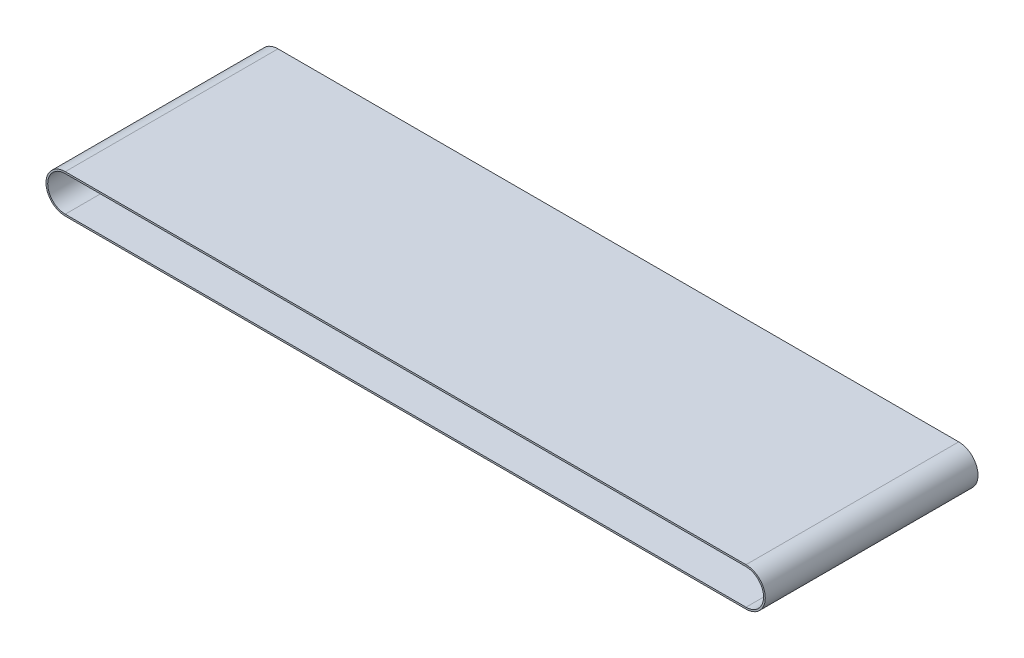
ISO-10303-21;
HEADER;
FILE_DESCRIPTION(('STEP AP214'),'2;1');
FILE_NAME('part.step','',(''),(''),'','','');
FILE_SCHEMA(('AUTOMOTIVE_DESIGN { 1 0 10303 214 1 1 1 1 }'));
ENDSEC;
DATA;
#1=APPLICATION_CONTEXT('core data for automotive mechanical design processes');
#2=APPLICATION_PROTOCOL_DEFINITION('international standard','automotive_design',2000,#1);
#3=PRODUCT_CONTEXT('',#1,'mechanical');
#4=PRODUCT('Part','Part','',(#3));
#5=PRODUCT_RELATED_PRODUCT_CATEGORY('part','',(#4));
#6=PRODUCT_DEFINITION_FORMATION('','',#4);
#7=PRODUCT_DEFINITION_CONTEXT('part definition',#1,'design');
#8=PRODUCT_DEFINITION('design','',#6,#7);
#9=PRODUCT_DEFINITION_SHAPE('','',#8);
#10=(LENGTH_UNIT() NAMED_UNIT(*) SI_UNIT(.MILLI.,.METRE.));
#11=(NAMED_UNIT(*) PLANE_ANGLE_UNIT() SI_UNIT($,.RADIAN.));
#12=(NAMED_UNIT(*) SI_UNIT($,.STERADIAN.) SOLID_ANGLE_UNIT());
#13=UNCERTAINTY_MEASURE_WITH_UNIT(LENGTH_MEASURE(1.E-05),#10,'distance_accuracy_value','');
#14=(GEOMETRIC_REPRESENTATION_CONTEXT(3) GLOBAL_UNCERTAINTY_ASSIGNED_CONTEXT((#13)) GLOBAL_UNIT_ASSIGNED_CONTEXT((#10,
#11,#12)) REPRESENTATION_CONTEXT('',''));
#15=CARTESIAN_POINT('',(0.,0.,0.));
#16=DIRECTION('',(0.,0.,1.));
#17=DIRECTION('',(1.,0.,0.));
#18=AXIS2_PLACEMENT_3D('',#15,#16,#17);
#19=CARTESIAN_POINT('',(0.,0.,250.));
#20=DIRECTION('',(0.,0.,1.));
#21=DIRECTION('',(1.,0.,0.));
#22=AXIS2_PLACEMENT_3D('',#19,#20,#21);
#23=PLANE('',#22);
#24=CARTESIAN_POINT('',(0.,0.,250.));
#25=DIRECTION('',(0.,0.,1.));
#26=DIRECTION('',(1.,0.,0.));
#27=AXIS2_PLACEMENT_3D('',#24,#25,#26);
#28=CIRCLE('',#27,22.6396360346952);
#29=CARTESIAN_POINT('',(0.,22.6396360346952,250.));
#30=VERTEX_POINT('',#29);
#31=CARTESIAN_POINT('',(0.,-22.6396360346952,250.));
#32=VERTEX_POINT('',#31);
#33=EDGE_CURVE('E143',#30,#32,#28,.T.);
#34=ORIENTED_EDGE('',*,*,#33,.T.);
#35=DIRECTION('',(1.,0.,0.));
#36=VECTOR('',#35,1.);
#37=CARTESIAN_POINT('',(0.,-22.6396360346952,250.));
#38=LINE('',#37,#36);
#39=CARTESIAN_POINT('',(800.,-22.6396360346952,250.));
#40=VERTEX_POINT('',#39);
#41=EDGE_CURVE('E146',#32,#40,#38,.T.);
#42=ORIENTED_EDGE('',*,*,#41,.T.);
#43=CARTESIAN_POINT('',(800.,0.,250.));
#44=DIRECTION('',(0.,0.,1.));
#45=DIRECTION('',(1.,0.,0.));
#46=AXIS2_PLACEMENT_3D('',#43,#44,#45);
#47=CIRCLE('',#46,22.6396360346952);
#48=CARTESIAN_POINT('',(800.,22.6396360346952,250.));
#49=VERTEX_POINT('',#48);
#50=EDGE_CURVE('E149',#40,#49,#47,.T.);
#51=ORIENTED_EDGE('',*,*,#50,.T.);
#52=DIRECTION('',(-1.,0.,0.));
#53=VECTOR('',#52,1.);
#54=CARTESIAN_POINT('',(0.,22.6396360346952,250.));
#55=LINE('',#54,#53);
#56=EDGE_CURVE('E151',#49,#30,#55,.T.);
#57=ORIENTED_EDGE('',*,*,#56,.T.);
#58=EDGE_LOOP('',(#34,#42,#51,#57));
#59=FACE_BOUND('',#58,.T.);
#60=DIRECTION('',(1.,0.,0.));
#61=VECTOR('',#60,1.);
#62=CARTESIAN_POINT('',(0.,-20.6396360346952,250.));
#63=LINE('',#62,#61);
#64=CARTESIAN_POINT('',(0.,-20.6396360346952,250.));
#65=VERTEX_POINT('',#64);
#66=CARTESIAN_POINT('',(800.,-20.6396360346952,250.));
#67=VERTEX_POINT('',#66);
#68=EDGE_CURVE('E115',#65,#67,#63,.T.);
#69=ORIENTED_EDGE('',*,*,#68,.F.);
#70=CARTESIAN_POINT('',(0.,0.,250.));
#71=DIRECTION('',(0.,0.,1.));
#72=DIRECTION('',(1.,0.,0.));
#73=AXIS2_PLACEMENT_3D('',#70,#71,#72);
#74=CIRCLE('',#73,20.6396360346952);
#75=CARTESIAN_POINT('',(0.,20.6396360346952,250.));
#76=VERTEX_POINT('',#75);
#77=EDGE_CURVE('E107',#76,#65,#74,.T.);
#78=ORIENTED_EDGE('',*,*,#77,.F.);
#79=DIRECTION('',(-1.,0.,0.));
#80=VECTOR('',#79,1.);
#81=CARTESIAN_POINT('',(0.,20.6396360346952,250.));
#82=LINE('',#81,#80);
#83=CARTESIAN_POINT('',(800.,20.6396360346952,250.));
#84=VERTEX_POINT('',#83);
#85=EDGE_CURVE('E129',#84,#76,#82,.T.);
#86=ORIENTED_EDGE('',*,*,#85,.F.);
#87=CARTESIAN_POINT('',(800.,0.,250.));
#88=DIRECTION('',(0.,0.,1.));
#89=DIRECTION('',(1.,0.,0.));
#90=AXIS2_PLACEMENT_3D('',#87,#88,#89);
#91=CIRCLE('',#90,20.6396360346952);
#92=EDGE_CURVE('E127',#67,#84,#91,.T.);
#93=ORIENTED_EDGE('',*,*,#92,.F.);
#94=EDGE_LOOP('',(#69,#78,#86,#93));
#95=FACE_BOUND('',#94,.T.);
#96=ADVANCED_FACE('F42',(#59,#95),#23,.T.);
#97=CARTESIAN_POINT('',(0.,0.,0.));
#98=DIRECTION('',(0.,0.,1.));
#99=DIRECTION('',(1.,0.,0.));
#100=AXIS2_PLACEMENT_3D('',#97,#98,#99);
#101=PLANE('',#100);
#102=CARTESIAN_POINT('',(0.,0.,0.));
#103=DIRECTION('',(0.,0.,1.));
#104=DIRECTION('',(1.,0.,0.));
#105=AXIS2_PLACEMENT_3D('',#102,#103,#104);
#106=CIRCLE('',#105,22.6396360346952);
#107=CARTESIAN_POINT('',(0.,22.6396360346952,0.));
#108=VERTEX_POINT('',#107);
#109=CARTESIAN_POINT('',(0.,-22.6396360346952,0.));
#110=VERTEX_POINT('',#109);
#111=EDGE_CURVE('E123',#108,#110,#106,.T.);
#112=ORIENTED_EDGE('',*,*,#111,.F.);
#113=DIRECTION('',(-1.,0.,0.));
#114=VECTOR('',#113,1.);
#115=CARTESIAN_POINT('',(0.,22.6396360346952,0.));
#116=LINE('',#115,#114);
#117=CARTESIAN_POINT('',(800.,22.6396360346952,0.));
#118=VERTEX_POINT('',#117);
#119=EDGE_CURVE('E147',#118,#108,#116,.T.);
#120=ORIENTED_EDGE('',*,*,#119,.F.);
#121=CARTESIAN_POINT('',(800.,0.,0.));
#122=DIRECTION('',(0.,0.,1.));
#123=DIRECTION('',(1.,0.,0.));
#124=AXIS2_PLACEMENT_3D('',#121,#122,#123);
#125=CIRCLE('',#124,22.6396360346952);
#126=CARTESIAN_POINT('',(800.,-22.6396360346952,0.));
#127=VERTEX_POINT('',#126);
#128=EDGE_CURVE('E158',#127,#118,#125,.T.);
#129=ORIENTED_EDGE('',*,*,#128,.F.);
#130=DIRECTION('',(1.,0.,0.));
#131=VECTOR('',#130,1.);
#132=CARTESIAN_POINT('',(0.,-22.6396360346952,0.));
#133=LINE('',#132,#131);
#134=EDGE_CURVE('E156',#110,#127,#133,.T.);
#135=ORIENTED_EDGE('',*,*,#134,.F.);
#136=EDGE_LOOP('',(#112,#120,#129,#135));
#137=FACE_BOUND('',#136,.T.);
#138=CARTESIAN_POINT('',(0.,0.,0.));
#139=DIRECTION('',(0.,0.,1.));
#140=DIRECTION('',(1.,0.,0.));
#141=AXIS2_PLACEMENT_3D('',#138,#139,#140);
#142=CIRCLE('',#141,20.6396360346952);
#143=CARTESIAN_POINT('',(0.,20.6396360346952,0.));
#144=VERTEX_POINT('',#143);
#145=CARTESIAN_POINT('',(0.,-20.6396360346952,0.));
#146=VERTEX_POINT('',#145);
#147=EDGE_CURVE('E65',#144,#146,#142,.T.);
#148=ORIENTED_EDGE('',*,*,#147,.T.);
#149=DIRECTION('',(1.,0.,0.));
#150=VECTOR('',#149,1.);
#151=CARTESIAN_POINT('',(0.,-20.6396360346952,0.));
#152=LINE('',#151,#150);
#153=CARTESIAN_POINT('',(800.,-20.6396360346952,0.));
#154=VERTEX_POINT('',#153);
#155=EDGE_CURVE('E122',#146,#154,#152,.T.);
#156=ORIENTED_EDGE('',*,*,#155,.T.);
#157=CARTESIAN_POINT('',(800.,0.,0.));
#158=DIRECTION('',(0.,0.,1.));
#159=DIRECTION('',(1.,0.,0.));
#160=AXIS2_PLACEMENT_3D('',#157,#158,#159);
#161=CIRCLE('',#160,20.6396360346952);
#162=CARTESIAN_POINT('',(800.,20.6396360346952,0.));
#163=VERTEX_POINT('',#162);
#164=EDGE_CURVE('E135',#154,#163,#161,.T.);
#165=ORIENTED_EDGE('',*,*,#164,.T.);
#166=DIRECTION('',(-1.,0.,0.));
#167=VECTOR('',#166,1.);
#168=CARTESIAN_POINT('',(0.,20.6396360346952,0.));
#169=LINE('',#168,#167);
#170=EDGE_CURVE('E116',#163,#144,#169,.T.);
#171=ORIENTED_EDGE('',*,*,#170,.T.);
#172=EDGE_LOOP('',(#148,#156,#165,#171));
#173=FACE_BOUND('',#172,.T.);
#174=ADVANCED_FACE('F176',(#137,#173),#101,.F.);
#175=CARTESIAN_POINT('',(0.,0.,250.));
#176=DIRECTION('',(0.,0.,-1.));
#177=DIRECTION('',(-1.,0.,0.));
#178=AXIS2_PLACEMENT_3D('',#175,#176,#177);
#179=CYLINDRICAL_SURFACE('',#178,22.6396360346952);
#180=ORIENTED_EDGE('',*,*,#111,.T.);
#181=DIRECTION('',(0.,0.,-1.));
#182=VECTOR('',#181,1.);
#183=CARTESIAN_POINT('',(0.,-22.6396360346952,250.));
#184=LINE('',#183,#182);
#185=EDGE_CURVE('E13',#32,#110,#184,.T.);
#186=ORIENTED_EDGE('',*,*,#185,.F.);
#187=ORIENTED_EDGE('',*,*,#33,.F.);
#188=DIRECTION('',(0.,0.,-1.));
#189=VECTOR('',#188,1.);
#190=CARTESIAN_POINT('',(0.,22.6396360346952,250.));
#191=LINE('',#190,#189);
#192=EDGE_CURVE('E153',#30,#108,#191,.T.);
#193=ORIENTED_EDGE('',*,*,#192,.T.);
#194=EDGE_LOOP('',(#180,#186,#187,#193));
#195=FACE_BOUND('',#194,.T.);
#196=ADVANCED_FACE('F44',(#195),#179,.T.);
#197=CARTESIAN_POINT('',(0.,-22.6396360346952,250.));
#198=DIRECTION('',(0.,1.,0.));
#199=DIRECTION('',(0.,0.,1.));
#200=AXIS2_PLACEMENT_3D('',#197,#198,#199);
#201=PLANE('',#200);
#202=ORIENTED_EDGE('',*,*,#134,.T.);
#203=DIRECTION('',(0.,0.,-1.));
#204=VECTOR('',#203,1.);
#205=CARTESIAN_POINT('',(800.,-22.6396360346952,250.));
#206=LINE('',#205,#204);
#207=EDGE_CURVE('E50',#40,#127,#206,.T.);
#208=ORIENTED_EDGE('',*,*,#207,.F.);
#209=ORIENTED_EDGE('',*,*,#41,.F.);
#210=ORIENTED_EDGE('',*,*,#185,.T.);
#211=EDGE_LOOP('',(#202,#208,#209,#210));
#212=FACE_BOUND('',#211,.T.);
#213=ADVANCED_FACE('F186',(#212),#201,.F.);
#214=CARTESIAN_POINT('',(800.,0.,250.));
#215=DIRECTION('',(0.,0.,-1.));
#216=DIRECTION('',(-1.,0.,0.));
#217=AXIS2_PLACEMENT_3D('',#214,#215,#216);
#218=CYLINDRICAL_SURFACE('',#217,22.6396360346952);
#219=ORIENTED_EDGE('',*,*,#128,.T.);
#220=DIRECTION('',(0.,0.,-1.));
#221=VECTOR('',#220,1.);
#222=CARTESIAN_POINT('',(800.,22.6396360346952,250.));
#223=LINE('',#222,#221);
#224=EDGE_CURVE('E163',#49,#118,#223,.T.);
#225=ORIENTED_EDGE('',*,*,#224,.F.);
#226=ORIENTED_EDGE('',*,*,#50,.F.);
#227=ORIENTED_EDGE('',*,*,#207,.T.);
#228=EDGE_LOOP('',(#219,#225,#226,#227));
#229=FACE_BOUND('',#228,.T.);
#230=ADVANCED_FACE('F170',(#229),#218,.T.);
#231=CARTESIAN_POINT('',(0.,22.6396360346952,250.));
#232=DIRECTION('',(0.,-1.,0.));
#233=DIRECTION('',(0.,0.,-1.));
#234=AXIS2_PLACEMENT_3D('',#231,#232,#233);
#235=PLANE('',#234);
#236=ORIENTED_EDGE('',*,*,#119,.T.);
#237=ORIENTED_EDGE('',*,*,#192,.F.);
#238=ORIENTED_EDGE('',*,*,#56,.F.);
#239=ORIENTED_EDGE('',*,*,#224,.T.);
#240=EDGE_LOOP('',(#236,#237,#238,#239));
#241=FACE_BOUND('',#240,.T.);
#242=ADVANCED_FACE('F180',(#241),#235,.F.);
#243=CARTESIAN_POINT('',(0.,0.,250.));
#244=DIRECTION('',(0.,0.,-1.));
#245=DIRECTION('',(-1.,0.,0.));
#246=AXIS2_PLACEMENT_3D('',#243,#244,#245);
#247=CYLINDRICAL_SURFACE('',#246,20.6396360346952);
#248=ORIENTED_EDGE('',*,*,#147,.F.);
#249=DIRECTION('',(0.,0.,-1.));
#250=VECTOR('',#249,1.);
#251=CARTESIAN_POINT('',(0.,20.6396360346952,250.));
#252=LINE('',#251,#250);
#253=EDGE_CURVE('E111',#76,#144,#252,.T.);
#254=ORIENTED_EDGE('',*,*,#253,.F.);
#255=ORIENTED_EDGE('',*,*,#77,.T.);
#256=DIRECTION('',(0.,0.,-1.));
#257=VECTOR('',#256,1.);
#258=CARTESIAN_POINT('',(0.,-20.6396360346952,250.));
#259=LINE('',#258,#257);
#260=EDGE_CURVE('E110',#65,#146,#259,.T.);
#261=ORIENTED_EDGE('',*,*,#260,.T.);
#262=EDGE_LOOP('',(#248,#254,#255,#261));
#263=FACE_BOUND('',#262,.T.);
#264=ADVANCED_FACE('F109',(#263),#247,.F.);
#265=CARTESIAN_POINT('',(0.,-20.6396360346952,250.));
#266=DIRECTION('',(0.,1.,0.));
#267=DIRECTION('',(0.,0.,1.));
#268=AXIS2_PLACEMENT_3D('',#265,#266,#267);
#269=PLANE('',#268);
#270=ORIENTED_EDGE('',*,*,#155,.F.);
#271=ORIENTED_EDGE('',*,*,#260,.F.);
#272=ORIENTED_EDGE('',*,*,#68,.T.);
#273=DIRECTION('',(0.,0.,-1.));
#274=VECTOR('',#273,1.);
#275=CARTESIAN_POINT('',(800.,-20.6396360346952,250.));
#276=LINE('',#275,#274);
#277=EDGE_CURVE('E124',#67,#154,#276,.T.);
#278=ORIENTED_EDGE('',*,*,#277,.T.);
#279=EDGE_LOOP('',(#270,#271,#272,#278));
#280=FACE_BOUND('',#279,.T.);
#281=ADVANCED_FACE('F119',(#280),#269,.T.);
#282=CARTESIAN_POINT('',(800.,0.,250.));
#283=DIRECTION('',(0.,0.,-1.));
#284=DIRECTION('',(-1.,0.,0.));
#285=AXIS2_PLACEMENT_3D('',#282,#283,#284);
#286=CYLINDRICAL_SURFACE('',#285,20.6396360346952);
#287=ORIENTED_EDGE('',*,*,#164,.F.);
#288=ORIENTED_EDGE('',*,*,#277,.F.);
#289=ORIENTED_EDGE('',*,*,#92,.T.);
#290=DIRECTION('',(0.,0.,-1.));
#291=VECTOR('',#290,1.);
#292=CARTESIAN_POINT('',(800.,20.6396360346952,250.));
#293=LINE('',#292,#291);
#294=EDGE_CURVE('E57',#84,#163,#293,.T.);
#295=ORIENTED_EDGE('',*,*,#294,.T.);
#296=EDGE_LOOP('',(#287,#288,#289,#295));
#297=FACE_BOUND('',#296,.T.);
#298=ADVANCED_FACE('F209',(#297),#286,.F.);
#299=CARTESIAN_POINT('',(0.,20.6396360346952,250.));
#300=DIRECTION('',(0.,-1.,0.));
#301=DIRECTION('',(0.,0.,-1.));
#302=AXIS2_PLACEMENT_3D('',#299,#300,#301);
#303=PLANE('',#302);
#304=ORIENTED_EDGE('',*,*,#170,.F.);
#305=ORIENTED_EDGE('',*,*,#294,.F.);
#306=ORIENTED_EDGE('',*,*,#85,.T.);
#307=ORIENTED_EDGE('',*,*,#253,.T.);
#308=EDGE_LOOP('',(#304,#305,#306,#307));
#309=FACE_BOUND('',#308,.T.);
#310=ADVANCED_FACE('F213',(#309),#303,.T.);
#311=CLOSED_SHELL('',(#96,#174,#196,#213,#230,#242,#264,#281,#298,#310));
#312=MANIFOLD_SOLID_BREP('B2',#311);
#313=ADVANCED_BREP_SHAPE_REPRESENTATION('',(#18,#312),#14);
#314=SHAPE_DEFINITION_REPRESENTATION(#9,#313);
ENDSEC;
END-ISO-10303-21;
